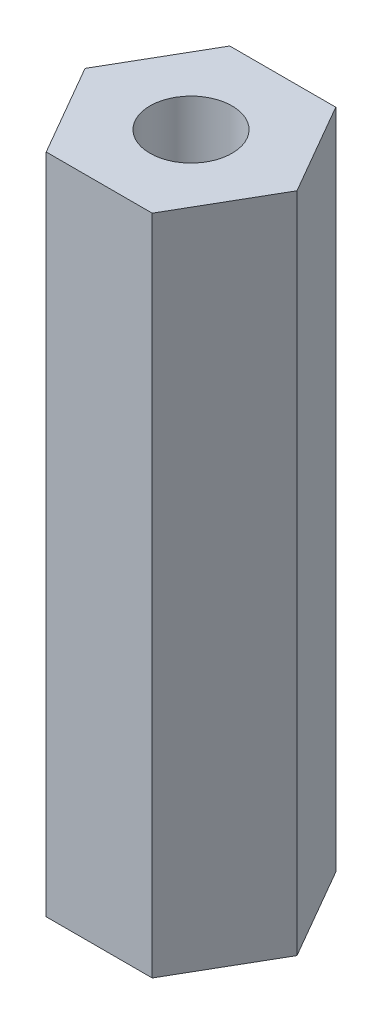
ISO-10303-21;
HEADER;
FILE_DESCRIPTION(('STEP AP214'),'2;1');
FILE_NAME('part.step','',(''),(''),'','','');
FILE_SCHEMA(('AUTOMOTIVE_DESIGN { 1 0 10303 214 1 1 1 1 }'));
ENDSEC;
DATA;
#1=APPLICATION_CONTEXT('core data for automotive mechanical design processes');
#2=APPLICATION_PROTOCOL_DEFINITION('international standard','automotive_design',2000,#1);
#3=PRODUCT_CONTEXT('',#1,'mechanical');
#4=PRODUCT('Part','Part','',(#3));
#5=PRODUCT_RELATED_PRODUCT_CATEGORY('part','',(#4));
#6=PRODUCT_DEFINITION_FORMATION('','',#4);
#7=PRODUCT_DEFINITION_CONTEXT('part definition',#1,'design');
#8=PRODUCT_DEFINITION('design','',#6,#7);
#9=PRODUCT_DEFINITION_SHAPE('','',#8);
#10=(LENGTH_UNIT() NAMED_UNIT(*) SI_UNIT(.MILLI.,.METRE.));
#11=(NAMED_UNIT(*) PLANE_ANGLE_UNIT() SI_UNIT($,.RADIAN.));
#12=(NAMED_UNIT(*) SI_UNIT($,.STERADIAN.) SOLID_ANGLE_UNIT());
#13=UNCERTAINTY_MEASURE_WITH_UNIT(LENGTH_MEASURE(1.E-05),#10,'distance_accuracy_value','');
#14=(GEOMETRIC_REPRESENTATION_CONTEXT(3) GLOBAL_UNCERTAINTY_ASSIGNED_CONTEXT((#13)) GLOBAL_UNIT_ASSIGNED_CONTEXT((#10,
#11,#12)) REPRESENTATION_CONTEXT('',''));
#15=CARTESIAN_POINT('',(0.,0.,0.));
#16=DIRECTION('',(0.,0.,1.));
#17=DIRECTION('',(1.,0.,0.));
#18=AXIS2_PLACEMENT_3D('',#15,#16,#17);
#19=CARTESIAN_POINT('',(0.,25.,0.));
#20=DIRECTION('',(0.,1.,0.));
#21=DIRECTION('',(0.,0.,1.));
#22=AXIS2_PLACEMENT_3D('',#19,#20,#21);
#23=PLANE('',#22);
#24=DIRECTION('',(-0.5,0.,-0.866025403784438));
#25=VECTOR('',#24,1.);
#26=CARTESIAN_POINT('',(4.,25.,0.));
#27=LINE('',#26,#25);
#28=CARTESIAN_POINT('',(4.,25.,0.));
#29=VERTEX_POINT('',#28);
#30=CARTESIAN_POINT('',(2.,25.,-3.46410161513775));
#31=VERTEX_POINT('',#30);
#32=EDGE_CURVE('E167',#29,#31,#27,.T.);
#33=ORIENTED_EDGE('',*,*,#32,.T.);
#34=DIRECTION('',(-1.,0.,0.));
#35=VECTOR('',#34,1.);
#36=CARTESIAN_POINT('',(2.,25.,-3.46410161513775));
#37=LINE('',#36,#35);
#38=CARTESIAN_POINT('',(-2.,25.,-3.46410161513776));
#39=VERTEX_POINT('',#38);
#40=EDGE_CURVE('E115',#31,#39,#37,.T.);
#41=ORIENTED_EDGE('',*,*,#40,.T.);
#42=DIRECTION('',(-0.5,0.,0.866025403784439));
#43=VECTOR('',#42,1.);
#44=CARTESIAN_POINT('',(-2.,25.,-3.46410161513776));
#45=LINE('',#44,#43);
#46=CARTESIAN_POINT('',(-4.,25.,0.));
#47=VERTEX_POINT('',#46);
#48=EDGE_CURVE('E128',#39,#47,#45,.T.);
#49=ORIENTED_EDGE('',*,*,#48,.T.);
#50=DIRECTION('',(0.5,0.,0.866025403784439));
#51=VECTOR('',#50,1.);
#52=CARTESIAN_POINT('',(-4.,25.,0.));
#53=LINE('',#52,#51);
#54=CARTESIAN_POINT('',(-2.,25.,3.46410161513775));
#55=VERTEX_POINT('',#54);
#56=EDGE_CURVE('E122',#47,#55,#53,.T.);
#57=ORIENTED_EDGE('',*,*,#56,.T.);
#58=DIRECTION('',(1.,0.,0.));
#59=VECTOR('',#58,1.);
#60=CARTESIAN_POINT('',(-2.,25.,3.46410161513775));
#61=LINE('',#60,#59);
#62=CARTESIAN_POINT('',(2.,25.,3.46410161513776));
#63=VERTEX_POINT('',#62);
#64=EDGE_CURVE('E126',#55,#63,#61,.T.);
#65=ORIENTED_EDGE('',*,*,#64,.T.);
#66=DIRECTION('',(0.5,0.,-0.866025403784439));
#67=VECTOR('',#66,1.);
#68=CARTESIAN_POINT('',(2.,25.,3.46410161513776));
#69=LINE('',#68,#67);
#70=EDGE_CURVE('E78',#63,#29,#69,.T.);
#71=ORIENTED_EDGE('',*,*,#70,.T.);
#72=EDGE_LOOP('',(#33,#41,#49,#57,#65,#71));
#73=FACE_BOUND('',#72,.T.);
#74=CARTESIAN_POINT('',(0.,25.,0.));
#75=DIRECTION('',(0.,1.,0.));
#76=DIRECTION('',(0.,0.,1.));
#77=AXIS2_PLACEMENT_3D('',#74,#75,#76);
#78=CIRCLE('',#77,1.55);
#79=CARTESIAN_POINT('',(0.,25.,1.55));
#80=VERTEX_POINT('',#79);
#81=EDGE_CURVE('E155',#80,#80,#78,.T.);
#82=ORIENTED_EDGE('',*,*,#81,.F.);
#83=EDGE_LOOP('',(#82));
#84=FACE_BOUND('',#83,.T.);
#85=ADVANCED_FACE('F60',(#73,#84),#23,.T.);
#86=CARTESIAN_POINT('',(0.,0.,0.));
#87=DIRECTION('',(0.,1.,0.));
#88=DIRECTION('',(0.,0.,1.));
#89=AXIS2_PLACEMENT_3D('',#86,#87,#88);
#90=PLANE('',#89);
#91=DIRECTION('',(-0.5,0.,-0.866025403784438));
#92=VECTOR('',#91,1.);
#93=CARTESIAN_POINT('',(4.,0.,0.));
#94=LINE('',#93,#92);
#95=CARTESIAN_POINT('',(4.,0.,0.));
#96=VERTEX_POINT('',#95);
#97=CARTESIAN_POINT('',(2.,0.,-3.46410161513775));
#98=VERTEX_POINT('',#97);
#99=EDGE_CURVE('E150',#96,#98,#94,.T.);
#100=ORIENTED_EDGE('',*,*,#99,.F.);
#101=DIRECTION('',(0.5,0.,-0.866025403784439));
#102=VECTOR('',#101,1.);
#103=CARTESIAN_POINT('',(2.,0.,3.46410161513776));
#104=LINE('',#103,#102);
#105=CARTESIAN_POINT('',(2.,0.,3.46410161513776));
#106=VERTEX_POINT('',#105);
#107=EDGE_CURVE('E107',#106,#96,#104,.T.);
#108=ORIENTED_EDGE('',*,*,#107,.F.);
#109=DIRECTION('',(1.,0.,0.));
#110=VECTOR('',#109,1.);
#111=CARTESIAN_POINT('',(-2.,0.,3.46410161513775));
#112=LINE('',#111,#110);
#113=CARTESIAN_POINT('',(-2.,0.,3.46410161513775));
#114=VERTEX_POINT('',#113);
#115=EDGE_CURVE('E101',#114,#106,#112,.T.);
#116=ORIENTED_EDGE('',*,*,#115,.F.);
#117=DIRECTION('',(0.5,0.,0.866025403784439));
#118=VECTOR('',#117,1.);
#119=CARTESIAN_POINT('',(-4.,0.,0.));
#120=LINE('',#119,#118);
#121=CARTESIAN_POINT('',(-4.,0.,0.));
#122=VERTEX_POINT('',#121);
#123=EDGE_CURVE('E137',#122,#114,#120,.T.);
#124=ORIENTED_EDGE('',*,*,#123,.F.);
#125=DIRECTION('',(-0.5,0.,0.866025403784439));
#126=VECTOR('',#125,1.);
#127=CARTESIAN_POINT('',(-2.,0.,-3.46410161513776));
#128=LINE('',#127,#126);
#129=CARTESIAN_POINT('',(-2.,0.,-3.46410161513776));
#130=VERTEX_POINT('',#129);
#131=EDGE_CURVE('E158',#130,#122,#128,.T.);
#132=ORIENTED_EDGE('',*,*,#131,.F.);
#133=DIRECTION('',(-1.,0.,0.));
#134=VECTOR('',#133,1.);
#135=CARTESIAN_POINT('',(2.,0.,-3.46410161513775));
#136=LINE('',#135,#134);
#137=EDGE_CURVE('E154',#98,#130,#136,.T.);
#138=ORIENTED_EDGE('',*,*,#137,.F.);
#139=EDGE_LOOP('',(#100,#108,#116,#124,#132,#138));
#140=FACE_BOUND('',#139,.T.);
#141=CARTESIAN_POINT('',(0.,0.,0.));
#142=DIRECTION('',(0.,1.,0.));
#143=DIRECTION('',(0.,0.,1.));
#144=AXIS2_PLACEMENT_3D('',#141,#142,#143);
#145=CIRCLE('',#144,1.55);
#146=CARTESIAN_POINT('',(0.,0.,1.55));
#147=VERTEX_POINT('',#146);
#148=EDGE_CURVE('E264',#147,#147,#145,.T.);
#149=ORIENTED_EDGE('',*,*,#148,.T.);
#150=EDGE_LOOP('',(#149));
#151=FACE_BOUND('',#150,.T.);
#152=ADVANCED_FACE('F180',(#140,#151),#90,.F.);
#153=CARTESIAN_POINT('',(4.,25.,0.));
#154=DIRECTION('',(-0.866025403784438,0.,0.5));
#155=DIRECTION('',(0.5,0.,0.866025403784439));
#156=AXIS2_PLACEMENT_3D('',#153,#154,#155);
#157=PLANE('',#156);
#158=ORIENTED_EDGE('',*,*,#99,.T.);
#159=DIRECTION('',(0.,-1.,0.));
#160=VECTOR('',#159,1.);
#161=CARTESIAN_POINT('',(2.,25.,-3.46410161513775));
#162=LINE('',#161,#160);
#163=EDGE_CURVE('E12',#31,#98,#162,.T.);
#164=ORIENTED_EDGE('',*,*,#163,.F.);
#165=ORIENTED_EDGE('',*,*,#32,.F.);
#166=DIRECTION('',(0.,-1.,0.));
#167=VECTOR('',#166,1.);
#168=CARTESIAN_POINT('',(4.,25.,0.));
#169=LINE('',#168,#167);
#170=EDGE_CURVE('E146',#29,#96,#169,.T.);
#171=ORIENTED_EDGE('',*,*,#170,.T.);
#172=EDGE_LOOP('',(#158,#164,#165,#171));
#173=FACE_BOUND('',#172,.T.);
#174=ADVANCED_FACE('F62',(#173),#157,.F.);
#175=CARTESIAN_POINT('',(2.,25.,-3.46410161513775));
#176=DIRECTION('',(0.,0.,1.));
#177=DIRECTION('',(1.,0.,0.));
#178=AXIS2_PLACEMENT_3D('',#175,#176,#177);
#179=PLANE('',#178);
#180=ORIENTED_EDGE('',*,*,#137,.T.);
#181=DIRECTION('',(0.,-1.,0.));
#182=VECTOR('',#181,1.);
#183=CARTESIAN_POINT('',(-2.,25.,-3.46410161513776));
#184=LINE('',#183,#182);
#185=EDGE_CURVE('E70',#39,#130,#184,.T.);
#186=ORIENTED_EDGE('',*,*,#185,.F.);
#187=ORIENTED_EDGE('',*,*,#40,.F.);
#188=ORIENTED_EDGE('',*,*,#163,.T.);
#189=EDGE_LOOP('',(#180,#186,#187,#188));
#190=FACE_BOUND('',#189,.T.);
#191=ADVANCED_FACE('F205',(#190),#179,.F.);
#192=CARTESIAN_POINT('',(-2.,25.,-3.46410161513776));
#193=DIRECTION('',(0.866025403784439,0.,0.5));
#194=DIRECTION('',(0.5,0.,-0.866025403784439));
#195=AXIS2_PLACEMENT_3D('',#192,#193,#194);
#196=PLANE('',#195);
#197=ORIENTED_EDGE('',*,*,#131,.T.);
#198=DIRECTION('',(0.,-1.,0.));
#199=VECTOR('',#198,1.);
#200=CARTESIAN_POINT('',(-4.,25.,0.));
#201=LINE('',#200,#199);
#202=EDGE_CURVE('E139',#47,#122,#201,.T.);
#203=ORIENTED_EDGE('',*,*,#202,.F.);
#204=ORIENTED_EDGE('',*,*,#48,.F.);
#205=ORIENTED_EDGE('',*,*,#185,.T.);
#206=EDGE_LOOP('',(#197,#203,#204,#205));
#207=FACE_BOUND('',#206,.T.);
#208=ADVANCED_FACE('F177',(#207),#196,.F.);
#209=CARTESIAN_POINT('',(-4.,25.,0.));
#210=DIRECTION('',(0.866025403784438,0.,-0.5));
#211=DIRECTION('',(-0.5,0.,-0.866025403784439));
#212=AXIS2_PLACEMENT_3D('',#209,#210,#211);
#213=PLANE('',#212);
#214=ORIENTED_EDGE('',*,*,#123,.T.);
#215=DIRECTION('',(0.,-1.,0.));
#216=VECTOR('',#215,1.);
#217=CARTESIAN_POINT('',(-2.,25.,3.46410161513775));
#218=LINE('',#217,#216);
#219=EDGE_CURVE('E134',#55,#114,#218,.T.);
#220=ORIENTED_EDGE('',*,*,#219,.F.);
#221=ORIENTED_EDGE('',*,*,#56,.F.);
#222=ORIENTED_EDGE('',*,*,#202,.T.);
#223=EDGE_LOOP('',(#214,#220,#221,#222));
#224=FACE_BOUND('',#223,.T.);
#225=ADVANCED_FACE('F135',(#224),#213,.F.);
#226=CARTESIAN_POINT('',(-2.,25.,3.46410161513775));
#227=DIRECTION('',(0.,0.,-1.));
#228=DIRECTION('',(-1.,0.,0.));
#229=AXIS2_PLACEMENT_3D('',#226,#227,#228);
#230=PLANE('',#229);
#231=ORIENTED_EDGE('',*,*,#115,.T.);
#232=DIRECTION('',(0.,-1.,0.));
#233=VECTOR('',#232,1.);
#234=CARTESIAN_POINT('',(2.,25.,3.46410161513776));
#235=LINE('',#234,#233);
#236=EDGE_CURVE('E140',#63,#106,#235,.T.);
#237=ORIENTED_EDGE('',*,*,#236,.F.);
#238=ORIENTED_EDGE('',*,*,#64,.F.);
#239=ORIENTED_EDGE('',*,*,#219,.T.);
#240=EDGE_LOOP('',(#231,#237,#238,#239));
#241=FACE_BOUND('',#240,.T.);
#242=ADVANCED_FACE('F142',(#241),#230,.F.);
#243=CARTESIAN_POINT('',(2.,25.,3.46410161513776));
#244=DIRECTION('',(-0.866025403784439,0.,-0.5));
#245=DIRECTION('',(-0.5,0.,0.866025403784439));
#246=AXIS2_PLACEMENT_3D('',#243,#244,#245);
#247=PLANE('',#246);
#248=ORIENTED_EDGE('',*,*,#107,.T.);
#249=ORIENTED_EDGE('',*,*,#170,.F.);
#250=ORIENTED_EDGE('',*,*,#70,.F.);
#251=ORIENTED_EDGE('',*,*,#236,.T.);
#252=EDGE_LOOP('',(#248,#249,#250,#251));
#253=FACE_BOUND('',#252,.T.);
#254=ADVANCED_FACE('F185',(#253),#247,.F.);
#255=CARTESIAN_POINT('',(0.,25.,0.));
#256=DIRECTION('',(0.,-1.,0.));
#257=DIRECTION('',(0.,0.,-1.));
#258=AXIS2_PLACEMENT_3D('',#255,#256,#257);
#259=CYLINDRICAL_SURFACE('',#258,1.55);
#260=ORIENTED_EDGE('',*,*,#81,.T.);
#261=EDGE_LOOP('',(#260));
#262=FACE_BOUND('',#261,.T.);
#263=ORIENTED_EDGE('',*,*,#148,.F.);
#264=EDGE_LOOP('',(#263));
#265=FACE_BOUND('',#264,.T.);
#266=ADVANCED_FACE('F187',(#262,#265),#259,.F.);
#267=CLOSED_SHELL('',(#85,#152,#174,#191,#208,#225,#242,#254,#266));
#268=MANIFOLD_SOLID_BREP('B2',#267);
#269=ADVANCED_BREP_SHAPE_REPRESENTATION('',(#18,#268),#14);
#270=SHAPE_DEFINITION_REPRESENTATION(#9,#269);
ENDSEC;
END-ISO-10303-21;
